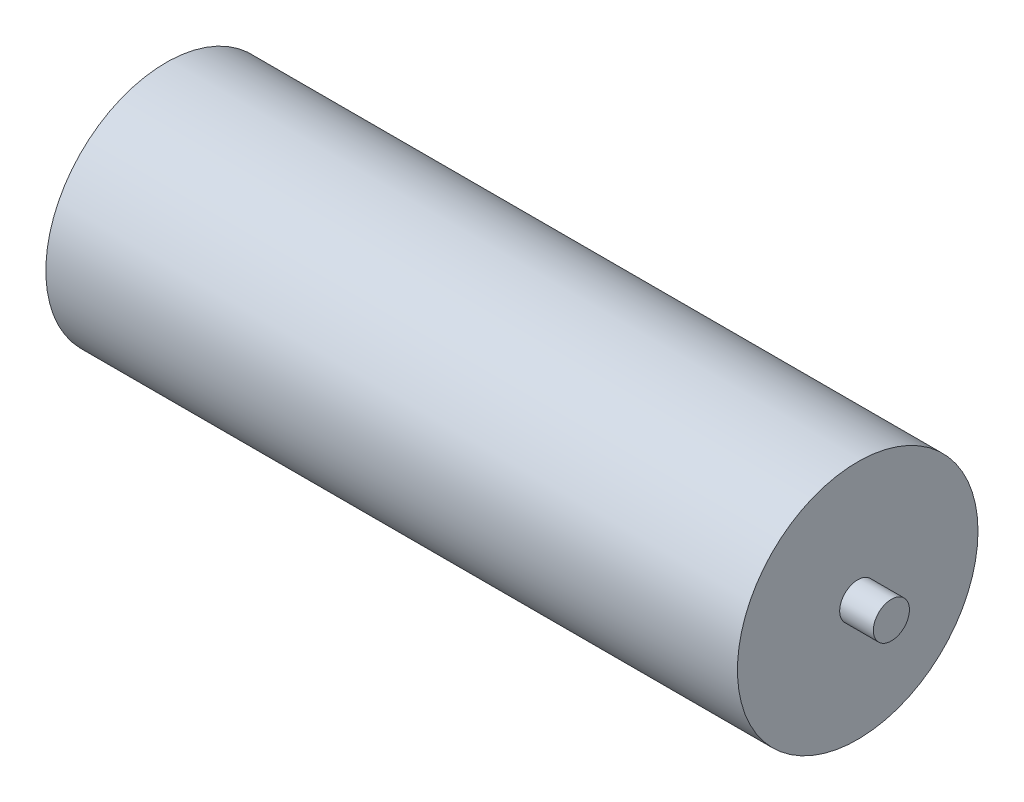
ISO-10303-21;
HEADER;
FILE_DESCRIPTION(('STEP AP214'),'2;1');
FILE_NAME('part.step','',(''),(''),'','','');
FILE_SCHEMA(('AUTOMOTIVE_DESIGN { 1 0 10303 214 1 1 1 1 }'));
ENDSEC;
DATA;
#1=APPLICATION_CONTEXT('core data for automotive mechanical design processes');
#2=APPLICATION_PROTOCOL_DEFINITION('international standard','automotive_design',2000,#1);
#3=PRODUCT_CONTEXT('',#1,'mechanical');
#4=PRODUCT('Part','Part','',(#3));
#5=PRODUCT_RELATED_PRODUCT_CATEGORY('part','',(#4));
#6=PRODUCT_DEFINITION_FORMATION('','',#4);
#7=PRODUCT_DEFINITION_CONTEXT('part definition',#1,'design');
#8=PRODUCT_DEFINITION('design','',#6,#7);
#9=PRODUCT_DEFINITION_SHAPE('','',#8);
#10=(LENGTH_UNIT() NAMED_UNIT(*) SI_UNIT(.MILLI.,.METRE.));
#11=(NAMED_UNIT(*) PLANE_ANGLE_UNIT() SI_UNIT($,.RADIAN.));
#12=(NAMED_UNIT(*) SI_UNIT($,.STERADIAN.) SOLID_ANGLE_UNIT());
#13=UNCERTAINTY_MEASURE_WITH_UNIT(LENGTH_MEASURE(1.E-05),#10,'distance_accuracy_value','');
#14=(GEOMETRIC_REPRESENTATION_CONTEXT(3) GLOBAL_UNCERTAINTY_ASSIGNED_CONTEXT((#13)) GLOBAL_UNIT_ASSIGNED_CONTEXT((#10,
#11,#12)) REPRESENTATION_CONTEXT('',''));
#15=CARTESIAN_POINT('',(0.,0.,0.));
#16=DIRECTION('',(0.,0.,1.));
#17=DIRECTION('',(1.,0.,0.));
#18=AXIS2_PLACEMENT_3D('',#15,#16,#17);
#19=CARTESIAN_POINT('',(146.05,0.,0.));
#20=DIRECTION('',(-1.,0.,0.));
#21=DIRECTION('',(0.,0.,1.));
#22=AXIS2_PLACEMENT_3D('',#19,#20,#21);
#23=CYLINDRICAL_SURFACE('',#22,25.4);
#24=CARTESIAN_POINT('',(146.05,0.,0.));
#25=DIRECTION('',(1.,0.,0.));
#26=DIRECTION('',(0.,0.,-1.));
#27=AXIS2_PLACEMENT_3D('',#24,#25,#26);
#28=CIRCLE('',#27,25.4);
#29=CARTESIAN_POINT('',(146.05,0.,-25.4));
#30=VERTEX_POINT('',#29);
#31=EDGE_CURVE('E10',#30,#30,#28,.T.);
#32=ORIENTED_EDGE('',*,*,#31,.F.);
#33=EDGE_LOOP('',(#32));
#34=FACE_BOUND('',#33,.T.);
#35=CARTESIAN_POINT('',(0.,0.,0.));
#36=DIRECTION('',(1.,0.,0.));
#37=DIRECTION('',(0.,0.,-1.));
#38=AXIS2_PLACEMENT_3D('',#35,#36,#37);
#39=CIRCLE('',#38,25.4);
#40=CARTESIAN_POINT('',(0.,0.,-25.4));
#41=VERTEX_POINT('',#40);
#42=EDGE_CURVE('E34',#41,#41,#39,.T.);
#43=ORIENTED_EDGE('',*,*,#42,.T.);
#44=EDGE_LOOP('',(#43));
#45=FACE_BOUND('',#44,.T.);
#46=ADVANCED_FACE('F31',(#34,#45),#23,.T.);
#47=CARTESIAN_POINT('',(146.05,0.,0.));
#48=DIRECTION('',(1.,0.,0.));
#49=DIRECTION('',(0.,0.,-1.));
#50=AXIS2_PLACEMENT_3D('',#47,#48,#49);
#51=PLANE('',#50);
#52=CARTESIAN_POINT('',(146.05,0.,0.));
#53=DIRECTION('',(1.,0.,0.));
#54=DIRECTION('',(0.,0.,-1.));
#55=AXIS2_PLACEMENT_3D('',#52,#53,#54);
#56=CIRCLE('',#55,3.81);
#57=CARTESIAN_POINT('',(146.05,0.,3.81));
#58=VERTEX_POINT('',#57);
#59=EDGE_CURVE('E43',#58,#58,#56,.T.);
#60=ORIENTED_EDGE('',*,*,#59,.F.);
#61=EDGE_LOOP('',(#60));
#62=FACE_BOUND('',#61,.T.);
#63=ORIENTED_EDGE('',*,*,#31,.T.);
#64=EDGE_LOOP('',(#63));
#65=FACE_BOUND('',#64,.T.);
#66=ADVANCED_FACE('F58',(#62,#65),#51,.T.);
#67=CARTESIAN_POINT('',(0.,0.,0.));
#68=DIRECTION('',(1.,0.,0.));
#69=DIRECTION('',(0.,0.,-1.));
#70=AXIS2_PLACEMENT_3D('',#67,#68,#69);
#71=PLANE('',#70);
#72=ORIENTED_EDGE('',*,*,#42,.F.);
#73=EDGE_LOOP('',(#72));
#74=FACE_BOUND('',#73,.T.);
#75=ADVANCED_FACE('F54',(#74),#71,.F.);
#76=CARTESIAN_POINT('',(153.162,0.,0.));
#77=DIRECTION('',(-1.,0.,0.));
#78=DIRECTION('',(0.,0.,1.));
#79=AXIS2_PLACEMENT_3D('',#76,#77,#78);
#80=CYLINDRICAL_SURFACE('',#79,3.81);
#81=CARTESIAN_POINT('',(153.162,0.,0.));
#82=DIRECTION('',(1.,0.,0.));
#83=DIRECTION('',(0.,0.,-1.));
#84=AXIS2_PLACEMENT_3D('',#81,#82,#83);
#85=CIRCLE('',#84,3.81);
#86=CARTESIAN_POINT('',(153.162,0.,3.81));
#87=VERTEX_POINT('',#86);
#88=EDGE_CURVE('E41',#87,#87,#85,.T.);
#89=CARTESIAN_POINT('',(153.162,0.,3.81));
#90=CARTESIAN_POINT('',(153.087916666667,0.,3.81));
#91=CARTESIAN_POINT('',(153.013833333333,0.,3.81));
#92=CARTESIAN_POINT('',(152.865666666667,0.,3.81));
#93=CARTESIAN_POINT('',(152.791583333333,0.,3.81));
#94=CARTESIAN_POINT('',(152.643416666667,0.,3.81));
#95=CARTESIAN_POINT('',(152.569333333333,0.,3.81));
#96=CARTESIAN_POINT('',(152.421166666667,0.,3.81));
#97=CARTESIAN_POINT('',(152.347083333333,0.,3.81));
#98=CARTESIAN_POINT('',(152.198916666667,0.,3.81));
#99=CARTESIAN_POINT('',(152.124833333333,0.,3.81));
#100=CARTESIAN_POINT('',(151.976666666667,0.,3.81));
#101=CARTESIAN_POINT('',(151.902583333333,0.,3.81));
#102=CARTESIAN_POINT('',(151.754416666667,0.,3.81));
#103=CARTESIAN_POINT('',(151.680333333333,0.,3.81));
#104=CARTESIAN_POINT('',(151.532166666667,0.,3.81));
#105=CARTESIAN_POINT('',(151.458083333333,0.,3.81));
#106=CARTESIAN_POINT('',(151.309916666667,0.,3.81));
#107=CARTESIAN_POINT('',(151.235833333333,0.,3.81));
#108=CARTESIAN_POINT('',(151.087666666667,0.,3.81));
#109=CARTESIAN_POINT('',(151.013583333333,0.,3.81));
#110=CARTESIAN_POINT('',(150.865416666667,0.,3.81));
#111=CARTESIAN_POINT('',(150.791333333333,0.,3.81));
#112=CARTESIAN_POINT('',(150.643166666667,0.,3.81));
#113=CARTESIAN_POINT('',(150.569083333333,0.,3.81));
#114=CARTESIAN_POINT('',(150.420916666667,0.,3.81));
#115=CARTESIAN_POINT('',(150.346833333333,0.,3.81));
#116=CARTESIAN_POINT('',(150.198666666667,0.,3.81));
#117=CARTESIAN_POINT('',(150.124583333333,0.,3.81));
#118=CARTESIAN_POINT('',(149.976416666667,0.,3.81));
#119=CARTESIAN_POINT('',(149.902333333333,0.,3.81));
#120=CARTESIAN_POINT('',(149.754166666667,0.,3.81));
#121=CARTESIAN_POINT('',(149.680083333333,0.,3.81));
#122=CARTESIAN_POINT('',(149.531916666667,0.,3.81));
#123=CARTESIAN_POINT('',(149.457833333333,0.,3.81));
#124=CARTESIAN_POINT('',(149.309666666667,0.,3.81));
#125=CARTESIAN_POINT('',(149.235583333333,0.,3.81));
#126=CARTESIAN_POINT('',(149.087416666667,0.,3.81));
#127=CARTESIAN_POINT('',(149.013333333333,0.,3.81));
#128=CARTESIAN_POINT('',(148.865166666667,0.,3.81));
#129=CARTESIAN_POINT('',(148.791083333333,0.,3.81));
#130=CARTESIAN_POINT('',(148.642916666667,0.,3.81));
#131=CARTESIAN_POINT('',(148.568833333333,0.,3.81));
#132=CARTESIAN_POINT('',(148.420666666667,0.,3.81));
#133=CARTESIAN_POINT('',(148.346583333333,0.,3.81));
#134=CARTESIAN_POINT('',(148.198416666667,0.,3.81));
#135=CARTESIAN_POINT('',(148.124333333333,0.,3.81));
#136=CARTESIAN_POINT('',(147.976166666667,0.,3.81));
#137=CARTESIAN_POINT('',(147.902083333333,0.,3.81));
#138=CARTESIAN_POINT('',(147.753916666667,0.,3.81));
#139=CARTESIAN_POINT('',(147.679833333333,0.,3.81));
#140=CARTESIAN_POINT('',(147.531666666667,0.,3.81));
#141=CARTESIAN_POINT('',(147.457583333333,0.,3.81));
#142=CARTESIAN_POINT('',(147.309416666667,0.,3.81));
#143=CARTESIAN_POINT('',(147.235333333333,0.,3.81));
#144=CARTESIAN_POINT('',(147.087166666667,0.,3.81));
#145=CARTESIAN_POINT('',(147.013083333333,0.,3.81));
#146=CARTESIAN_POINT('',(146.864916666667,0.,3.81));
#147=CARTESIAN_POINT('',(146.790833333333,0.,3.81));
#148=CARTESIAN_POINT('',(146.642666666667,0.,3.81));
#149=CARTESIAN_POINT('',(146.568583333333,0.,3.81));
#150=CARTESIAN_POINT('',(146.420416666667,0.,3.81));
#151=CARTESIAN_POINT('',(146.346333333333,0.,3.81));
#152=CARTESIAN_POINT('',(146.198166666667,0.,3.81));
#153=CARTESIAN_POINT('',(146.124083333333,0.,3.81));
#154=CARTESIAN_POINT('',(146.05,0.,3.81));
#155=B_SPLINE_CURVE_WITH_KNOTS('',3,(#89,#90,#91,#92,#93,#94,#95,#96,#97,#98,#99,#100,#101,#102,
#103,#104,#105,#106,#107,#108,#109,#110,#111,#112,#113,#114,#115,#116,#117,#118,#119,#120,#121,
#122,#123,#124,#125,#126,#127,#128,#129,#130,#131,#132,#133,#134,#135,#136,#137,#138,#139,#140,
#141,#142,#143,#144,#145,#146,#147,#148,#149,#150,#151,#152,#153,#154),.UNSPECIFIED.,.F.,.F.,(4,
2,2,2,2,2,2,2,2,2,2,2,2,2,2,2,2,2,2,2,2,2,2,2,2,2,2,2,2,2,2,2,4),(0.,0.222249999999979,
0.444499999999987,0.666749999999994,0.888999999999973,1.11124999999998,1.33349999999999,
1.55574999999999,1.77799999999997,2.00024999999998,2.22249999999999,2.44474999999997,
2.66699999999997,2.88924999999998,3.11149999999999,3.33374999999997,3.55599999999998,
3.77824999999998,4.00049999999996,4.22274999999997,4.44499999999998,4.66724999999998,
4.88949999999996,5.11174999999997,5.33399999999998,5.55624999999996,5.77849999999996,
6.00074999999997,6.22299999999998,6.44524999999996,6.66749999999996,6.88974999999997,
7.11199999999995),.UNSPECIFIED.);
#156=EDGE_CURVE('BSEAM51',#87,#58,#155,.T.);
#157=ORIENTED_EDGE('',*,*,#88,.F.);
#158=ORIENTED_EDGE('',*,*,#59,.T.);
#159=ORIENTED_EDGE('',*,*,#156,.T.);
#160=ORIENTED_EDGE('',*,*,#156,.F.);
#161=EDGE_LOOP('',(#157,#159,#158,#160));
#162=FACE_BOUND('',#161,.T.);
#163=ADVANCED_FACE('F51',(#162),#80,.T.);
#164=CARTESIAN_POINT('',(153.162,0.,0.));
#165=DIRECTION('',(1.,0.,0.));
#166=DIRECTION('',(0.,0.,-1.));
#167=AXIS2_PLACEMENT_3D('',#164,#165,#166);
#168=PLANE('',#167);
#169=ORIENTED_EDGE('',*,*,#88,.T.);
#170=EDGE_LOOP('',(#169));
#171=FACE_BOUND('',#170,.T.);
#172=ADVANCED_FACE('F49',(#171),#168,.T.);
#173=CLOSED_SHELL('',(#46,#66,#75,#163,#172));
#174=MANIFOLD_SOLID_BREP('B2',#173);
#175=ADVANCED_BREP_SHAPE_REPRESENTATION('',(#18,#174),#14);
#176=SHAPE_DEFINITION_REPRESENTATION(#9,#175);
ENDSEC;
END-ISO-10303-21;
